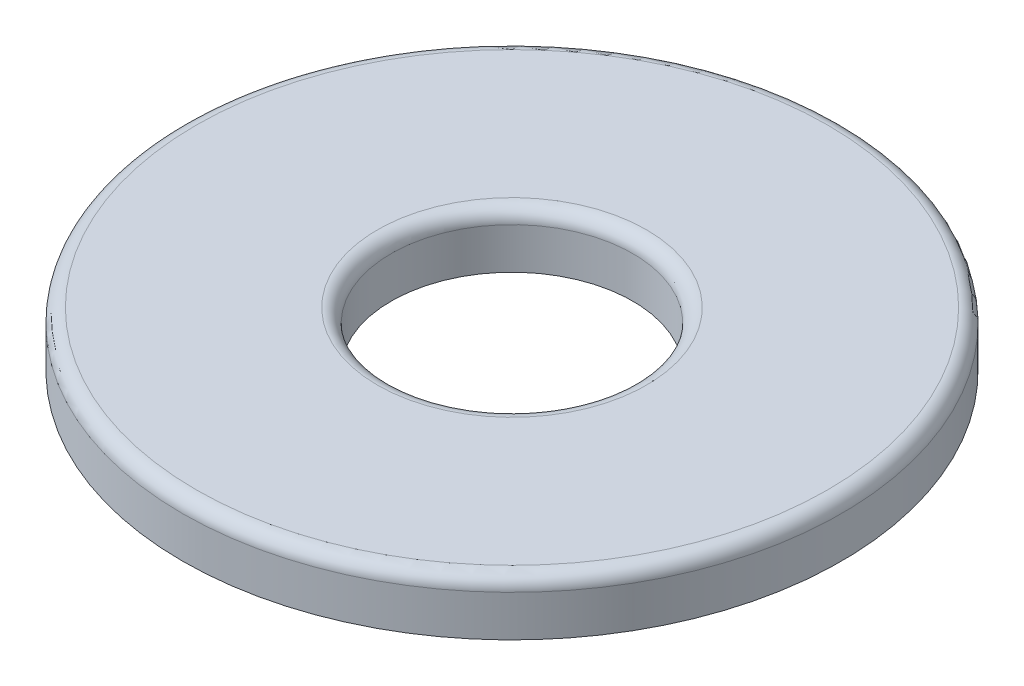
ISO-10303-21;
HEADER;
FILE_DESCRIPTION(('STEP AP214'),'2;1');
FILE_NAME('part.step','',(''),(''),'','','');
FILE_SCHEMA(('AUTOMOTIVE_DESIGN { 1 0 10303 214 1 1 1 1 }'));
ENDSEC;
DATA;
#1=APPLICATION_CONTEXT('core data for automotive mechanical design processes');
#2=APPLICATION_PROTOCOL_DEFINITION('international standard','automotive_design',2000,#1);
#3=PRODUCT_CONTEXT('',#1,'mechanical');
#4=PRODUCT('Part','Part','',(#3));
#5=PRODUCT_RELATED_PRODUCT_CATEGORY('part','',(#4));
#6=PRODUCT_DEFINITION_FORMATION('','',#4);
#7=PRODUCT_DEFINITION_CONTEXT('part definition',#1,'design');
#8=PRODUCT_DEFINITION('design','',#6,#7);
#9=PRODUCT_DEFINITION_SHAPE('','',#8);
#10=(LENGTH_UNIT() NAMED_UNIT(*) SI_UNIT(.MILLI.,.METRE.));
#11=(NAMED_UNIT(*) PLANE_ANGLE_UNIT() SI_UNIT($,.RADIAN.));
#12=(NAMED_UNIT(*) SI_UNIT($,.STERADIAN.) SOLID_ANGLE_UNIT());
#13=UNCERTAINTY_MEASURE_WITH_UNIT(LENGTH_MEASURE(1.E-05),#10,'distance_accuracy_value','');
#14=(GEOMETRIC_REPRESENTATION_CONTEXT(3) GLOBAL_UNCERTAINTY_ASSIGNED_CONTEXT((#13)) GLOBAL_UNIT_ASSIGNED_CONTEXT((#10,
#11,#12)) REPRESENTATION_CONTEXT('',''));
#15=CARTESIAN_POINT('',(0.,0.,0.));
#16=DIRECTION('',(0.,0.,1.));
#17=DIRECTION('',(1.,0.,0.));
#18=AXIS2_PLACEMENT_3D('',#15,#16,#17);
#19=CARTESIAN_POINT('',(0.,1.,0.));
#20=DIRECTION('',(0.,1.,0.));
#21=DIRECTION('',(0.,0.,1.));
#22=AXIS2_PLACEMENT_3D('',#19,#20,#21);
#23=PLANE('',#22);
#24=CARTESIAN_POINT('',(0.,1.,0.));
#25=DIRECTION('',(0.,1.,0.));
#26=DIRECTION('',(0.,0.,1.));
#27=AXIS2_PLACEMENT_3D('',#24,#25,#26);
#28=CIRCLE('',#27,2.45);
#29=CARTESIAN_POINT('',(0.,1.,2.45));
#30=VERTEX_POINT('',#29);
#31=EDGE_CURVE('E48',#30,#30,#28,.F.);
#32=ORIENTED_EDGE('',*,*,#31,.T.);
#33=EDGE_LOOP('',(#32));
#34=FACE_BOUND('',#33,.T.);
#35=CARTESIAN_POINT('',(0.,1.,0.));
#36=DIRECTION('',(0.,1.,0.));
#37=DIRECTION('',(0.,0.,1.));
#38=AXIS2_PLACEMENT_3D('',#35,#36,#37);
#39=CIRCLE('',#38,5.75);
#40=CARTESIAN_POINT('',(0.,1.,5.75));
#41=VERTEX_POINT('',#40);
#42=EDGE_CURVE('E53',#41,#41,#39,.T.);
#43=ORIENTED_EDGE('',*,*,#42,.T.);
#44=EDGE_LOOP('',(#43));
#45=FACE_BOUND('',#44,.T.);
#46=ADVANCED_FACE('F40',(#34,#45),#23,.T.);
#47=CARTESIAN_POINT('',(0.,0.,0.));
#48=DIRECTION('',(0.,1.,0.));
#49=DIRECTION('',(0.,0.,1.));
#50=AXIS2_PLACEMENT_3D('',#47,#48,#49);
#51=PLANE('',#50);
#52=CARTESIAN_POINT('',(0.,0.,0.));
#53=DIRECTION('',(0.,1.,0.));
#54=DIRECTION('',(0.,0.,1.));
#55=AXIS2_PLACEMENT_3D('',#52,#53,#54);
#56=CIRCLE('',#55,6.);
#57=CARTESIAN_POINT('',(0.,0.,6.));
#58=VERTEX_POINT('',#57);
#59=EDGE_CURVE('E64',#58,#58,#56,.T.);
#60=ORIENTED_EDGE('',*,*,#59,.F.);
#61=EDGE_LOOP('',(#60));
#62=FACE_BOUND('',#61,.T.);
#63=CARTESIAN_POINT('',(0.,0.,0.));
#64=DIRECTION('',(0.,1.,0.));
#65=DIRECTION('',(0.,0.,1.));
#66=AXIS2_PLACEMENT_3D('',#63,#64,#65);
#67=CIRCLE('',#66,2.2);
#68=CARTESIAN_POINT('',(0.,0.,2.2));
#69=VERTEX_POINT('',#68);
#70=EDGE_CURVE('E68',#69,#69,#67,.T.);
#71=ORIENTED_EDGE('',*,*,#70,.T.);
#72=EDGE_LOOP('',(#71));
#73=FACE_BOUND('',#72,.T.);
#74=ADVANCED_FACE('F73',(#62,#73),#51,.F.);
#75=CARTESIAN_POINT('',(0.,1.,0.));
#76=DIRECTION('',(0.,-1.,0.));
#77=DIRECTION('',(0.,0.,-1.));
#78=AXIS2_PLACEMENT_3D('',#75,#76,#77);
#79=CYLINDRICAL_SURFACE('',#78,6.);
#80=CARTESIAN_POINT('',(0.,0.75,0.));
#81=DIRECTION('',(0.,1.,0.));
#82=DIRECTION('',(0.,0.,1.));
#83=AXIS2_PLACEMENT_3D('',#80,#81,#82);
#84=CIRCLE('',#83,6.);
#85=CARTESIAN_POINT('',(0.,0.75,6.));
#86=VERTEX_POINT('',#85);
#87=EDGE_CURVE('E10',#86,#86,#84,.F.);
#88=ORIENTED_EDGE('',*,*,#87,.T.);
#89=EDGE_LOOP('',(#88));
#90=FACE_BOUND('',#89,.T.);
#91=ORIENTED_EDGE('',*,*,#59,.T.);
#92=EDGE_LOOP('',(#91));
#93=FACE_BOUND('',#92,.T.);
#94=ADVANCED_FACE('F78',(#90,#93),#79,.T.);
#95=CARTESIAN_POINT('',(0.,1.,0.));
#96=DIRECTION('',(0.,-1.,0.));
#97=DIRECTION('',(0.,0.,-1.));
#98=AXIS2_PLACEMENT_3D('',#95,#96,#97);
#99=CYLINDRICAL_SURFACE('',#98,2.2);
#100=CARTESIAN_POINT('',(0.,0.75,0.));
#101=DIRECTION('',(0.,1.,0.));
#102=DIRECTION('',(0.,0.,1.));
#103=AXIS2_PLACEMENT_3D('',#100,#101,#102);
#104=CIRCLE('',#103,2.2);
#105=CARTESIAN_POINT('',(0.,0.75,2.2));
#106=VERTEX_POINT('',#105);
#107=EDGE_CURVE('E58',#106,#106,#104,.T.);
#108=ORIENTED_EDGE('',*,*,#107,.T.);
#109=EDGE_LOOP('',(#108));
#110=FACE_BOUND('',#109,.T.);
#111=ORIENTED_EDGE('',*,*,#70,.F.);
#112=EDGE_LOOP('',(#111));
#113=FACE_BOUND('',#112,.T.);
#114=ADVANCED_FACE('F75',(#110,#113),#99,.F.);
#115=CARTESIAN_POINT('',(0.,0.75,0.));
#116=DIRECTION('',(0.,1.,0.));
#117=DIRECTION('',(0.,0.,1.));
#118=AXIS2_PLACEMENT_3D('',#115,#116,#117);
#119=TOROIDAL_SURFACE('',#118,2.45,0.25);
#120=ORIENTED_EDGE('',*,*,#31,.F.);
#121=EDGE_LOOP('',(#120));
#122=FACE_BOUND('',#121,.T.);
#123=ORIENTED_EDGE('',*,*,#107,.F.);
#124=EDGE_LOOP('',(#123));
#125=FACE_BOUND('',#124,.T.);
#126=ADVANCED_FACE('F77',(#122,#125),#119,.T.);
#127=CARTESIAN_POINT('',(0.,0.75,0.));
#128=DIRECTION('',(0.,1.,0.));
#129=DIRECTION('',(0.,0.,1.));
#130=AXIS2_PLACEMENT_3D('',#127,#128,#129);
#131=TOROIDAL_SURFACE('',#130,5.75,0.25);
#132=ORIENTED_EDGE('',*,*,#87,.F.);
#133=EDGE_LOOP('',(#132));
#134=FACE_BOUND('',#133,.T.);
#135=ORIENTED_EDGE('',*,*,#42,.F.);
#136=EDGE_LOOP('',(#135));
#137=FACE_BOUND('',#136,.T.);
#138=ADVANCED_FACE('F42',(#134,#137),#131,.T.);
#139=CLOSED_SHELL('',(#46,#74,#94,#114,#126,#138));
#140=MANIFOLD_SOLID_BREP('B2',#139);
#141=ADVANCED_BREP_SHAPE_REPRESENTATION('',(#18,#140),#14);
#142=SHAPE_DEFINITION_REPRESENTATION(#9,#141);
ENDSEC;
END-ISO-10303-21;
